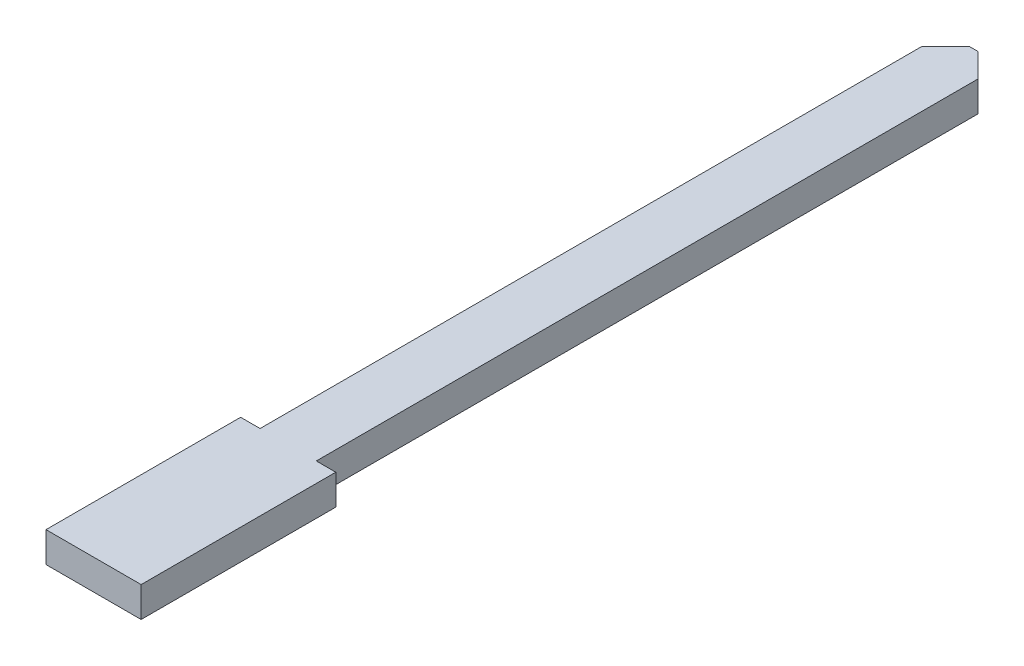
ISO-10303-21;
HEADER;
FILE_DESCRIPTION(('STEP AP214'),'2;1');
FILE_NAME('part.step','',(''),(''),'','','');
FILE_SCHEMA(('AUTOMOTIVE_DESIGN { 1 0 10303 214 1 1 1 1 }'));
ENDSEC;
DATA;
#1=APPLICATION_CONTEXT('core data for automotive mechanical design processes');
#2=APPLICATION_PROTOCOL_DEFINITION('international standard','automotive_design',2000,#1);
#3=PRODUCT_CONTEXT('',#1,'mechanical');
#4=PRODUCT('Part','Part','',(#3));
#5=PRODUCT_RELATED_PRODUCT_CATEGORY('part','',(#4));
#6=PRODUCT_DEFINITION_FORMATION('','',#4);
#7=PRODUCT_DEFINITION_CONTEXT('part definition',#1,'design');
#8=PRODUCT_DEFINITION('design','',#6,#7);
#9=PRODUCT_DEFINITION_SHAPE('','',#8);
#10=(LENGTH_UNIT() NAMED_UNIT(*) SI_UNIT(.MILLI.,.METRE.));
#11=(NAMED_UNIT(*) PLANE_ANGLE_UNIT() SI_UNIT($,.RADIAN.));
#12=(NAMED_UNIT(*) SI_UNIT($,.STERADIAN.) SOLID_ANGLE_UNIT());
#13=UNCERTAINTY_MEASURE_WITH_UNIT(LENGTH_MEASURE(1.E-05),#10,'distance_accuracy_value','');
#14=(GEOMETRIC_REPRESENTATION_CONTEXT(3) GLOBAL_UNCERTAINTY_ASSIGNED_CONTEXT((#13)) GLOBAL_UNIT_ASSIGNED_CONTEXT((#10,
#11,#12)) REPRESENTATION_CONTEXT('',''));
#15=CARTESIAN_POINT('',(0.,0.,0.));
#16=DIRECTION('',(0.,0.,1.));
#17=DIRECTION('',(1.,0.,0.));
#18=AXIS2_PLACEMENT_3D('',#15,#16,#17);
#19=CARTESIAN_POINT('',(-6.55,0.35,4.5));
#20=DIRECTION('',(0.,1.,0.));
#21=DIRECTION('',(0.,0.,1.));
#22=AXIS2_PLACEMENT_3D('',#19,#20,#21);
#23=PLANE('',#22);
#24=DIRECTION('',(0.,0.,-1.));
#25=VECTOR('',#24,1.);
#26=CARTESIAN_POINT('',(-4.35,0.35,4.5));
#27=LINE('',#26,#25);
#28=CARTESIAN_POINT('',(-4.35,0.35,0.));
#29=VERTEX_POINT('',#28);
#30=CARTESIAN_POINT('',(-4.35,0.35,4.5));
#31=VERTEX_POINT('',#30);
#32=EDGE_CURVE('E127',#29,#31,#27,.F.);
#33=ORIENTED_EDGE('',*,*,#32,.F.);
#34=DIRECTION('',(-1.,0.,0.));
#35=VECTOR('',#34,1.);
#36=CARTESIAN_POINT('',(-4.35,0.35,0.));
#37=LINE('',#36,#35);
#38=CARTESIAN_POINT('',(-4.8,0.35,0.));
#39=VERTEX_POINT('',#38);
#40=EDGE_CURVE('E122',#39,#29,#37,.F.);
#41=ORIENTED_EDGE('',*,*,#40,.F.);
#42=DIRECTION('',(0.,0.,1.));
#43=VECTOR('',#42,1.);
#44=CARTESIAN_POINT('',(-4.8,0.35,-15.85));
#45=LINE('',#44,#43);
#46=CARTESIAN_POINT('',(-4.8,0.35,-15.3));
#47=VERTEX_POINT('',#46);
#48=EDGE_CURVE('E92',#39,#47,#45,.F.);
#49=ORIENTED_EDGE('',*,*,#48,.T.);
#50=DIRECTION('',(-0.707106781186548,0.,-0.707106781186548));
#51=VECTOR('',#50,1.);
#52=CARTESIAN_POINT('',(-5.35,0.35,-15.85));
#53=LINE('',#52,#51);
#54=CARTESIAN_POINT('',(-5.35000000000001,0.35,-15.85));
#55=VERTEX_POINT('',#54);
#56=EDGE_CURVE('E95',#55,#47,#53,.F.);
#57=ORIENTED_EDGE('',*,*,#56,.F.);
#58=DIRECTION('',(-1.,0.,0.));
#59=VECTOR('',#58,1.);
#60=CARTESIAN_POINT('',(-4.8,0.35,-15.85));
#61=LINE('',#60,#59);
#62=CARTESIAN_POINT('',(-5.55,0.35,-15.85));
#63=VERTEX_POINT('',#62);
#64=EDGE_CURVE('E98',#63,#55,#61,.F.);
#65=ORIENTED_EDGE('',*,*,#64,.F.);
#66=DIRECTION('',(-0.707106781186548,0.,0.707106781186547));
#67=VECTOR('',#66,1.);
#68=CARTESIAN_POINT('',(-5.55,0.35,-15.85));
#69=LINE('',#68,#67);
#70=CARTESIAN_POINT('',(-6.1,0.35,-15.3));
#71=VERTEX_POINT('',#70);
#72=EDGE_CURVE('E20',#63,#71,#69,.T.);
#73=ORIENTED_EDGE('',*,*,#72,.T.);
#74=DIRECTION('',(0.,0.,-1.));
#75=VECTOR('',#74,1.);
#76=CARTESIAN_POINT('',(-6.1,0.35,-15.85));
#77=LINE('',#76,#75);
#78=CARTESIAN_POINT('',(-6.1,0.35,0.));
#79=VERTEX_POINT('',#78);
#80=EDGE_CURVE('E146',#71,#79,#77,.F.);
#81=ORIENTED_EDGE('',*,*,#80,.T.);
#82=DIRECTION('',(-1.,0.,0.));
#83=VECTOR('',#82,1.);
#84=CARTESIAN_POINT('',(-4.35,0.35,0.));
#85=LINE('',#84,#83);
#86=CARTESIAN_POINT('',(-6.55,0.35,0.));
#87=VERTEX_POINT('',#86);
#88=EDGE_CURVE('E142',#87,#79,#85,.F.);
#89=ORIENTED_EDGE('',*,*,#88,.F.);
#90=DIRECTION('',(0.,0.,1.));
#91=VECTOR('',#90,1.);
#92=CARTESIAN_POINT('',(-6.55,0.35,4.5));
#93=LINE('',#92,#91);
#94=CARTESIAN_POINT('',(-6.55,0.35,4.5));
#95=VERTEX_POINT('',#94);
#96=EDGE_CURVE('E137',#95,#87,#93,.F.);
#97=ORIENTED_EDGE('',*,*,#96,.F.);
#98=DIRECTION('',(-1.,0.,0.));
#99=VECTOR('',#98,1.);
#100=CARTESIAN_POINT('',(-4.35,0.35,4.5));
#101=LINE('',#100,#99);
#102=EDGE_CURVE('E131',#95,#31,#101,.F.);
#103=ORIENTED_EDGE('',*,*,#102,.T.);
#104=EDGE_LOOP('',(#33,#41,#49,#57,#65,#73,#81,#89,#97,#103));
#105=FACE_BOUND('',#104,.T.);
#106=ADVANCED_FACE('F17',(#105),#23,.T.);
#107=CARTESIAN_POINT('',(-4.8,0.35,-15.85));
#108=DIRECTION('',(0.,0.,-1.));
#109=DIRECTION('',(-1.,0.,0.));
#110=AXIS2_PLACEMENT_3D('',#107,#108,#109);
#111=PLANE('',#110);
#112=DIRECTION('',(1.,0.,0.));
#113=VECTOR('',#112,1.);
#114=CARTESIAN_POINT('',(-4.35,-0.35,-15.85));
#115=LINE('',#114,#113);
#116=CARTESIAN_POINT('',(-5.55,-0.35,-15.85));
#117=VERTEX_POINT('',#116);
#118=CARTESIAN_POINT('',(-5.35000000000001,-0.35,-15.85));
#119=VERTEX_POINT('',#118);
#120=EDGE_CURVE('E151',#117,#119,#115,.T.);
#121=ORIENTED_EDGE('',*,*,#120,.F.);
#122=DIRECTION('',(0.,1.,0.));
#123=VECTOR('',#122,1.);
#124=CARTESIAN_POINT('',(-5.55,0.35,-15.85));
#125=LINE('',#124,#123);
#126=EDGE_CURVE('E109',#63,#117,#125,.F.);
#127=ORIENTED_EDGE('',*,*,#126,.F.);
#128=ORIENTED_EDGE('',*,*,#64,.T.);
#129=DIRECTION('',(0.,1.,0.));
#130=VECTOR('',#129,1.);
#131=CARTESIAN_POINT('',(-5.35000000000001,0.35,-15.85));
#132=LINE('',#131,#130);
#133=EDGE_CURVE('E103',#119,#55,#132,.T.);
#134=ORIENTED_EDGE('',*,*,#133,.F.);
#135=EDGE_LOOP('',(#121,#127,#128,#134));
#136=FACE_BOUND('',#135,.T.);
#137=ADVANCED_FACE('F106',(#136),#111,.T.);
#138=CARTESIAN_POINT('',(-5.35,0.35,-15.85));
#139=DIRECTION('',(0.707106781186548,0.,-0.707106781186548));
#140=DIRECTION('',(-0.707106781186548,0.,-0.707106781186548));
#141=AXIS2_PLACEMENT_3D('',#138,#139,#140);
#142=PLANE('',#141);
#143=DIRECTION('',(0.707106781186555,0.,0.70710678118654));
#144=VECTOR('',#143,1.);
#145=CARTESIAN_POINT('',(-5.35000000000001,-0.35,-15.85));
#146=LINE('',#145,#144);
#147=CARTESIAN_POINT('',(-4.8,-0.35,-15.3));
#148=VERTEX_POINT('',#147);
#149=EDGE_CURVE('E112',#119,#148,#146,.T.);
#150=ORIENTED_EDGE('',*,*,#149,.F.);
#151=ORIENTED_EDGE('',*,*,#133,.T.);
#152=ORIENTED_EDGE('',*,*,#56,.T.);
#153=DIRECTION('',(0.,1.,0.));
#154=VECTOR('',#153,1.);
#155=CARTESIAN_POINT('',(-4.8,0.35,-15.3));
#156=LINE('',#155,#154);
#157=EDGE_CURVE('E115',#47,#148,#156,.F.);
#158=ORIENTED_EDGE('',*,*,#157,.T.);
#159=EDGE_LOOP('',(#150,#151,#152,#158));
#160=FACE_BOUND('',#159,.T.);
#161=ADVANCED_FACE('F110',(#160),#142,.T.);
#162=CARTESIAN_POINT('',(-4.8,0.35,-15.85));
#163=DIRECTION('',(-1.,0.,0.));
#164=DIRECTION('',(0.,0.,1.));
#165=AXIS2_PLACEMENT_3D('',#162,#163,#164);
#166=PLANE('',#165);
#167=ORIENTED_EDGE('',*,*,#157,.F.);
#168=ORIENTED_EDGE('',*,*,#48,.F.);
#169=DIRECTION('',(0.,1.,0.));
#170=VECTOR('',#169,1.);
#171=CARTESIAN_POINT('',(-4.8,0.35,0.));
#172=LINE('',#171,#170);
#173=CARTESIAN_POINT('',(-4.8,-0.35,0.));
#174=VERTEX_POINT('',#173);
#175=EDGE_CURVE('E119',#174,#39,#172,.T.);
#176=ORIENTED_EDGE('',*,*,#175,.F.);
#177=DIRECTION('',(0.,0.,-1.));
#178=VECTOR('',#177,1.);
#179=CARTESIAN_POINT('',(-4.8,-0.35,4.5));
#180=LINE('',#179,#178);
#181=EDGE_CURVE('E154',#148,#174,#180,.F.);
#182=ORIENTED_EDGE('',*,*,#181,.F.);
#183=EDGE_LOOP('',(#167,#168,#176,#182));
#184=FACE_BOUND('',#183,.T.);
#185=ADVANCED_FACE('F211',(#184),#166,.F.);
#186=CARTESIAN_POINT('',(-4.35,0.35,0.));
#187=DIRECTION('',(0.,0.,-1.));
#188=DIRECTION('',(-1.,0.,0.));
#189=AXIS2_PLACEMENT_3D('',#186,#187,#188);
#190=PLANE('',#189);
#191=DIRECTION('',(0.,1.,0.));
#192=VECTOR('',#191,1.);
#193=CARTESIAN_POINT('',(-4.35,0.35,0.));
#194=LINE('',#193,#192);
#195=CARTESIAN_POINT('',(-4.35,-0.35,0.));
#196=VERTEX_POINT('',#195);
#197=EDGE_CURVE('E124',#196,#29,#194,.T.);
#198=ORIENTED_EDGE('',*,*,#197,.F.);
#199=DIRECTION('',(1.,0.,0.));
#200=VECTOR('',#199,1.);
#201=CARTESIAN_POINT('',(-4.35,-0.35,0.));
#202=LINE('',#201,#200);
#203=EDGE_CURVE('E157',#174,#196,#202,.T.);
#204=ORIENTED_EDGE('',*,*,#203,.F.);
#205=ORIENTED_EDGE('',*,*,#175,.T.);
#206=ORIENTED_EDGE('',*,*,#40,.T.);
#207=EDGE_LOOP('',(#198,#204,#205,#206));
#208=FACE_BOUND('',#207,.T.);
#209=ADVANCED_FACE('F207',(#208),#190,.T.);
#210=CARTESIAN_POINT('',(-4.35,0.35,4.5));
#211=DIRECTION('',(1.,0.,0.));
#212=DIRECTION('',(0.,0.,-1.));
#213=AXIS2_PLACEMENT_3D('',#210,#211,#212);
#214=PLANE('',#213);
#215=DIRECTION('',(0.,1.,0.));
#216=VECTOR('',#215,1.);
#217=CARTESIAN_POINT('',(-4.35,0.35,4.5));
#218=LINE('',#217,#216);
#219=CARTESIAN_POINT('',(-4.35,-0.35,4.5));
#220=VERTEX_POINT('',#219);
#221=EDGE_CURVE('E129',#31,#220,#218,.F.);
#222=ORIENTED_EDGE('',*,*,#221,.T.);
#223=DIRECTION('',(0.,0.,-1.));
#224=VECTOR('',#223,1.);
#225=CARTESIAN_POINT('',(-4.35,-0.35,4.5));
#226=LINE('',#225,#224);
#227=EDGE_CURVE('E160',#196,#220,#226,.F.);
#228=ORIENTED_EDGE('',*,*,#227,.F.);
#229=ORIENTED_EDGE('',*,*,#197,.T.);
#230=ORIENTED_EDGE('',*,*,#32,.T.);
#231=EDGE_LOOP('',(#222,#228,#229,#230));
#232=FACE_BOUND('',#231,.T.);
#233=ADVANCED_FACE('F203',(#232),#214,.T.);
#234=CARTESIAN_POINT('',(-4.35,0.35,4.5));
#235=DIRECTION('',(0.,0.,-1.));
#236=DIRECTION('',(-1.,0.,0.));
#237=AXIS2_PLACEMENT_3D('',#234,#235,#236);
#238=PLANE('',#237);
#239=DIRECTION('',(0.,1.,0.));
#240=VECTOR('',#239,1.);
#241=CARTESIAN_POINT('',(-6.55,-0.35,4.5));
#242=LINE('',#241,#240);
#243=CARTESIAN_POINT('',(-6.55,-0.35,4.5));
#244=VERTEX_POINT('',#243);
#245=EDGE_CURVE('E134',#244,#95,#242,.T.);
#246=ORIENTED_EDGE('',*,*,#245,.F.);
#247=DIRECTION('',(1.,0.,0.));
#248=VECTOR('',#247,1.);
#249=CARTESIAN_POINT('',(-4.35,-0.35,4.5));
#250=LINE('',#249,#248);
#251=EDGE_CURVE('E163',#220,#244,#250,.F.);
#252=ORIENTED_EDGE('',*,*,#251,.F.);
#253=ORIENTED_EDGE('',*,*,#221,.F.);
#254=ORIENTED_EDGE('',*,*,#102,.F.);
#255=EDGE_LOOP('',(#246,#252,#253,#254));
#256=FACE_BOUND('',#255,.T.);
#257=ADVANCED_FACE('F199',(#256),#238,.F.);
#258=CARTESIAN_POINT('',(-6.55,-0.35,4.5));
#259=DIRECTION('',(-1.,0.,0.));
#260=DIRECTION('',(0.,0.,1.));
#261=AXIS2_PLACEMENT_3D('',#258,#259,#260);
#262=PLANE('',#261);
#263=ORIENTED_EDGE('',*,*,#245,.T.);
#264=ORIENTED_EDGE('',*,*,#96,.T.);
#265=DIRECTION('',(0.,1.,0.));
#266=VECTOR('',#265,1.);
#267=CARTESIAN_POINT('',(-6.55,0.35,0.));
#268=LINE('',#267,#266);
#269=CARTESIAN_POINT('',(-6.55,-0.35,0.));
#270=VERTEX_POINT('',#269);
#271=EDGE_CURVE('E139',#270,#87,#268,.T.);
#272=ORIENTED_EDGE('',*,*,#271,.F.);
#273=DIRECTION('',(0.,0.,-1.));
#274=VECTOR('',#273,1.);
#275=CARTESIAN_POINT('',(-6.55,-0.35,4.5));
#276=LINE('',#275,#274);
#277=EDGE_CURVE('E166',#244,#270,#276,.T.);
#278=ORIENTED_EDGE('',*,*,#277,.F.);
#279=EDGE_LOOP('',(#263,#264,#272,#278));
#280=FACE_BOUND('',#279,.T.);
#281=ADVANCED_FACE('F196',(#280),#262,.T.);
#282=CARTESIAN_POINT('',(-4.35,0.35,0.));
#283=DIRECTION('',(0.,0.,-1.));
#284=DIRECTION('',(-1.,0.,0.));
#285=AXIS2_PLACEMENT_3D('',#282,#283,#284);
#286=PLANE('',#285);
#287=ORIENTED_EDGE('',*,*,#271,.T.);
#288=ORIENTED_EDGE('',*,*,#88,.T.);
#289=DIRECTION('',(0.,1.,0.));
#290=VECTOR('',#289,1.);
#291=CARTESIAN_POINT('',(-6.1,-0.35,0.));
#292=LINE('',#291,#290);
#293=CARTESIAN_POINT('',(-6.1,-0.35,0.));
#294=VERTEX_POINT('',#293);
#295=EDGE_CURVE('E144',#79,#294,#292,.F.);
#296=ORIENTED_EDGE('',*,*,#295,.T.);
#297=DIRECTION('',(1.,0.,0.));
#298=VECTOR('',#297,1.);
#299=CARTESIAN_POINT('',(-4.35,-0.35,0.));
#300=LINE('',#299,#298);
#301=EDGE_CURVE('E169',#270,#294,#300,.T.);
#302=ORIENTED_EDGE('',*,*,#301,.F.);
#303=EDGE_LOOP('',(#287,#288,#296,#302));
#304=FACE_BOUND('',#303,.T.);
#305=ADVANCED_FACE('F179',(#304),#286,.T.);
#306=CARTESIAN_POINT('',(-6.1,-0.35,-15.85));
#307=DIRECTION('',(1.,0.,0.));
#308=DIRECTION('',(0.,0.,-1.));
#309=AXIS2_PLACEMENT_3D('',#306,#307,#308);
#310=PLANE('',#309);
#311=DIRECTION('',(0.,1.,0.));
#312=VECTOR('',#311,1.);
#313=CARTESIAN_POINT('',(-6.1,0.35,-15.3));
#314=LINE('',#313,#312);
#315=CARTESIAN_POINT('',(-6.1,-0.35,-15.3));
#316=VERTEX_POINT('',#315);
#317=EDGE_CURVE('E35',#316,#71,#314,.T.);
#318=ORIENTED_EDGE('',*,*,#317,.F.);
#319=DIRECTION('',(0.,0.,-1.));
#320=VECTOR('',#319,1.);
#321=CARTESIAN_POINT('',(-6.1,-0.35,4.5));
#322=LINE('',#321,#320);
#323=EDGE_CURVE('E26',#294,#316,#322,.T.);
#324=ORIENTED_EDGE('',*,*,#323,.F.);
#325=ORIENTED_EDGE('',*,*,#295,.F.);
#326=ORIENTED_EDGE('',*,*,#80,.F.);
#327=EDGE_LOOP('',(#318,#324,#325,#326));
#328=FACE_BOUND('',#327,.T.);
#329=ADVANCED_FACE('F177',(#328),#310,.F.);
#330=CARTESIAN_POINT('',(-5.55,0.35,-15.85));
#331=DIRECTION('',(-0.707106781186548,0.,-0.707106781186548));
#332=DIRECTION('',(-0.707106781186548,0.,0.707106781186548));
#333=AXIS2_PLACEMENT_3D('',#330,#331,#332);
#334=PLANE('',#333);
#335=ORIENTED_EDGE('',*,*,#72,.F.);
#336=ORIENTED_EDGE('',*,*,#126,.T.);
#337=DIRECTION('',(0.707106781186548,0.,-0.707106781186547));
#338=VECTOR('',#337,1.);
#339=CARTESIAN_POINT('',(-6.1,-0.35,-15.3));
#340=LINE('',#339,#338);
#341=EDGE_CURVE('E11',#316,#117,#340,.T.);
#342=ORIENTED_EDGE('',*,*,#341,.F.);
#343=ORIENTED_EDGE('',*,*,#317,.T.);
#344=EDGE_LOOP('',(#335,#336,#342,#343));
#345=FACE_BOUND('',#344,.T.);
#346=ADVANCED_FACE('F183',(#345),#334,.T.);
#347=CARTESIAN_POINT('',(-4.35,-0.35,4.5));
#348=DIRECTION('',(0.,-1.,0.));
#349=DIRECTION('',(0.,0.,-1.));
#350=AXIS2_PLACEMENT_3D('',#347,#348,#349);
#351=PLANE('',#350);
#352=ORIENTED_EDGE('',*,*,#323,.T.);
#353=ORIENTED_EDGE('',*,*,#341,.T.);
#354=ORIENTED_EDGE('',*,*,#120,.T.);
#355=ORIENTED_EDGE('',*,*,#149,.T.);
#356=ORIENTED_EDGE('',*,*,#181,.T.);
#357=ORIENTED_EDGE('',*,*,#203,.T.);
#358=ORIENTED_EDGE('',*,*,#227,.T.);
#359=ORIENTED_EDGE('',*,*,#251,.T.);
#360=ORIENTED_EDGE('',*,*,#277,.T.);
#361=ORIENTED_EDGE('',*,*,#301,.T.);
#362=EDGE_LOOP('',(#352,#353,#354,#355,#356,#357,#358,#359,#360,#361));
#363=FACE_BOUND('',#362,.T.);
#364=ADVANCED_FACE('F174',(#363),#351,.T.);
#365=CLOSED_SHELL('',(#106,#137,#161,#185,#209,#233,#257,#281,#305,#329,#346,#364));
#366=MANIFOLD_SOLID_BREP('B1',#365);
#367=ADVANCED_BREP_SHAPE_REPRESENTATION('',(#18,#366),#14);
#368=SHAPE_DEFINITION_REPRESENTATION(#9,#367);
ENDSEC;
END-ISO-10303-21;
